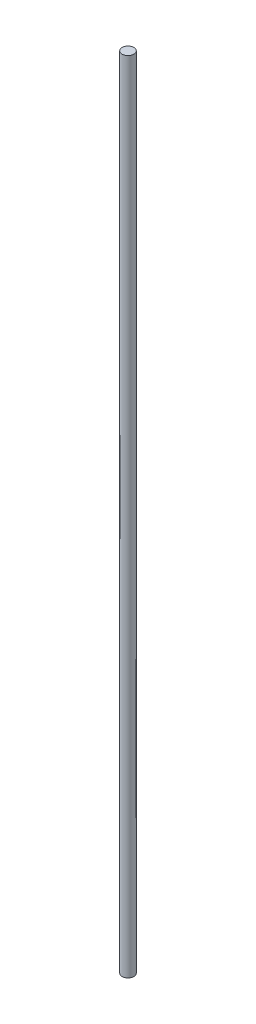
ISO-10303-21;
HEADER;
FILE_DESCRIPTION(('STEP AP214'),'2;1');
FILE_NAME('part.step','',(''),(''),'','','');
FILE_SCHEMA(('AUTOMOTIVE_DESIGN { 1 0 10303 214 1 1 1 1 }'));
ENDSEC;
DATA;
#1=APPLICATION_CONTEXT('core data for automotive mechanical design processes');
#2=APPLICATION_PROTOCOL_DEFINITION('international standard','automotive_design',2000,#1);
#3=PRODUCT_CONTEXT('',#1,'mechanical');
#4=PRODUCT('Part','Part','',(#3));
#5=PRODUCT_RELATED_PRODUCT_CATEGORY('part','',(#4));
#6=PRODUCT_DEFINITION_FORMATION('','',#4);
#7=PRODUCT_DEFINITION_CONTEXT('part definition',#1,'design');
#8=PRODUCT_DEFINITION('design','',#6,#7);
#9=PRODUCT_DEFINITION_SHAPE('','',#8);
#10=(LENGTH_UNIT() NAMED_UNIT(*) SI_UNIT(.MILLI.,.METRE.));
#11=(NAMED_UNIT(*) PLANE_ANGLE_UNIT() SI_UNIT($,.RADIAN.));
#12=(NAMED_UNIT(*) SI_UNIT($,.STERADIAN.) SOLID_ANGLE_UNIT());
#13=UNCERTAINTY_MEASURE_WITH_UNIT(LENGTH_MEASURE(1.E-05),#10,'distance_accuracy_value','');
#14=(GEOMETRIC_REPRESENTATION_CONTEXT(3) GLOBAL_UNCERTAINTY_ASSIGNED_CONTEXT((#13)) GLOBAL_UNIT_ASSIGNED_CONTEXT((#10,
#11,#12)) REPRESENTATION_CONTEXT('',''));
#15=CARTESIAN_POINT('',(0.,0.,0.));
#16=DIRECTION('',(0.,0.,1.));
#17=DIRECTION('',(1.,0.,0.));
#18=AXIS2_PLACEMENT_3D('',#15,#16,#17);
#19=CARTESIAN_POINT('',(0.,272.,0.));
#20=DIRECTION('',(0.,-1.,0.));
#21=DIRECTION('',(0.,0.,-1.));
#22=AXIS2_PLACEMENT_3D('',#19,#20,#21);
#23=CYLINDRICAL_SURFACE('',#22,4.);
#24=CARTESIAN_POINT('',(0.,272.,0.));
#25=DIRECTION('',(0.,1.,0.));
#26=DIRECTION('',(0.,0.,1.));
#27=AXIS2_PLACEMENT_3D('',#24,#25,#26);
#28=CIRCLE('',#27,4.);
#29=CARTESIAN_POINT('',(0.,272.,4.));
#30=VERTEX_POINT('',#29);
#31=EDGE_CURVE('E10',#30,#30,#28,.T.);
#32=ORIENTED_EDGE('',*,*,#31,.F.);
#33=EDGE_LOOP('',(#32));
#34=FACE_BOUND('',#33,.T.);
#35=CARTESIAN_POINT('',(0.,-272.,0.));
#36=DIRECTION('',(0.,1.,0.));
#37=DIRECTION('',(0.,0.,1.));
#38=AXIS2_PLACEMENT_3D('',#35,#36,#37);
#39=CIRCLE('',#38,4.);
#40=CARTESIAN_POINT('',(0.,-272.,4.));
#41=VERTEX_POINT('',#40);
#42=EDGE_CURVE('E46',#41,#41,#39,.T.);
#43=ORIENTED_EDGE('',*,*,#42,.T.);
#44=EDGE_LOOP('',(#43));
#45=FACE_BOUND('',#44,.T.);
#46=ADVANCED_FACE('F43',(#34,#45),#23,.T.);
#47=CARTESIAN_POINT('',(0.,272.,0.));
#48=DIRECTION('',(0.,1.,0.));
#49=DIRECTION('',(0.,0.,1.));
#50=AXIS2_PLACEMENT_3D('',#47,#48,#49);
#51=PLANE('',#50);
#52=ORIENTED_EDGE('',*,*,#31,.T.);
#53=EDGE_LOOP('',(#52));
#54=FACE_BOUND('',#53,.T.);
#55=ADVANCED_FACE('F60',(#54),#51,.T.);
#56=CARTESIAN_POINT('',(0.,-272.,0.));
#57=DIRECTION('',(0.,1.,0.));
#58=DIRECTION('',(0.,0.,1.));
#59=AXIS2_PLACEMENT_3D('',#56,#57,#58);
#60=PLANE('',#59);
#61=ORIENTED_EDGE('',*,*,#42,.F.);
#62=EDGE_LOOP('',(#61));
#63=FACE_BOUND('',#62,.T.);
#64=ADVANCED_FACE('F58',(#63),#60,.F.);
#65=CLOSED_SHELL('',(#46,#55,#64));
#66=MANIFOLD_SOLID_BREP('B2',#65);
#67=ADVANCED_BREP_SHAPE_REPRESENTATION('',(#18,#66),#14);
#68=SHAPE_DEFINITION_REPRESENTATION(#9,#67);
ENDSEC;
END-ISO-10303-21;
